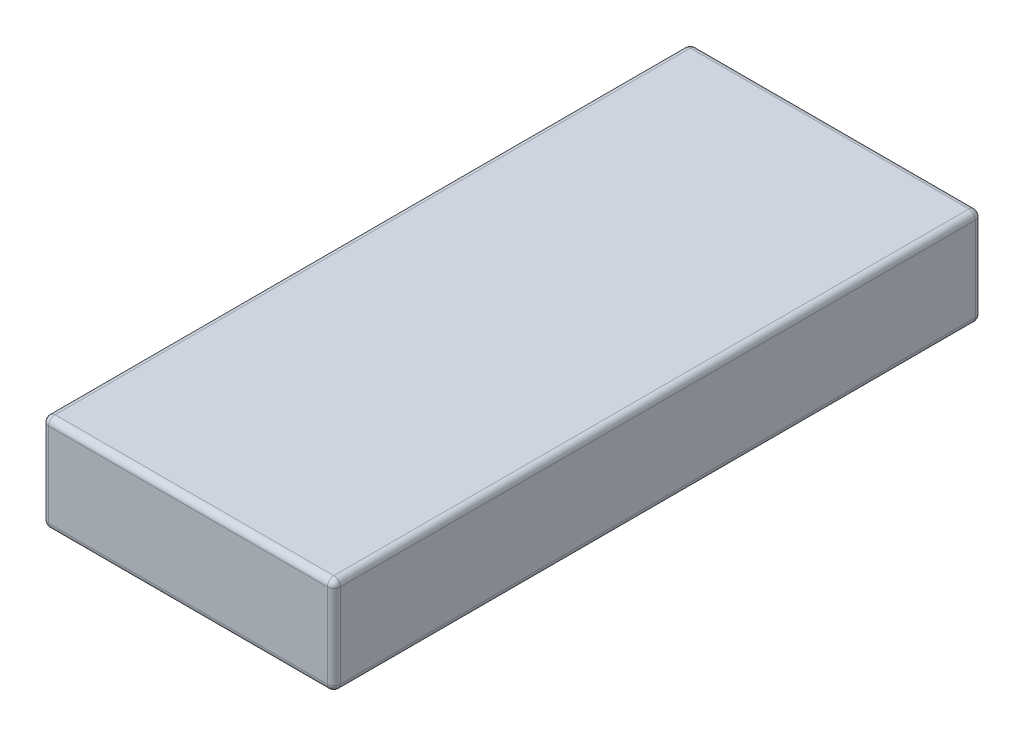
ISO-10303-21;
HEADER;
FILE_DESCRIPTION(('STEP AP214'),'2;1');
FILE_NAME('part.step','',(''),(''),'','','');
FILE_SCHEMA(('AUTOMOTIVE_DESIGN { 1 0 10303 214 1 1 1 1 }'));
ENDSEC;
DATA;
#1=APPLICATION_CONTEXT('core data for automotive mechanical design processes');
#2=APPLICATION_PROTOCOL_DEFINITION('international standard','automotive_design',2000,#1);
#3=PRODUCT_CONTEXT('',#1,'mechanical');
#4=PRODUCT('Part','Part','',(#3));
#5=PRODUCT_RELATED_PRODUCT_CATEGORY('part','',(#4));
#6=PRODUCT_DEFINITION_FORMATION('','',#4);
#7=PRODUCT_DEFINITION_CONTEXT('part definition',#1,'design');
#8=PRODUCT_DEFINITION('design','',#6,#7);
#9=PRODUCT_DEFINITION_SHAPE('','',#8);
#10=(LENGTH_UNIT() NAMED_UNIT(*) SI_UNIT(.MILLI.,.METRE.));
#11=(NAMED_UNIT(*) PLANE_ANGLE_UNIT() SI_UNIT($,.RADIAN.));
#12=(NAMED_UNIT(*) SI_UNIT($,.STERADIAN.) SOLID_ANGLE_UNIT());
#13=UNCERTAINTY_MEASURE_WITH_UNIT(LENGTH_MEASURE(1.E-05),#10,'distance_accuracy_value','');
#14=(GEOMETRIC_REPRESENTATION_CONTEXT(3) GLOBAL_UNCERTAINTY_ASSIGNED_CONTEXT((#13)) GLOBAL_UNIT_ASSIGNED_CONTEXT((#10,
#11,#12)) REPRESENTATION_CONTEXT('',''));
#15=CARTESIAN_POINT('',(0.,0.,0.));
#16=DIRECTION('',(0.,0.,1.));
#17=DIRECTION('',(1.,0.,0.));
#18=AXIS2_PLACEMENT_3D('',#15,#16,#17);
#19=CARTESIAN_POINT('',(450.,300.,-1000.));
#20=DIRECTION('',(-1.,0.,0.));
#21=DIRECTION('',(0.,0.,1.));
#22=AXIS2_PLACEMENT_3D('',#19,#20,#21);
#23=PLANE('',#22);
#24=DIRECTION('',(0.,-1.,0.));
#25=VECTOR('',#24,1.);
#26=CARTESIAN_POINT('',(450.,300.,980.));
#27=LINE('',#26,#25);
#28=CARTESIAN_POINT('',(450.,280.,980.));
#29=VERTEX_POINT('',#28);
#30=CARTESIAN_POINT('',(450.,20.,980.));
#31=VERTEX_POINT('',#30);
#32=EDGE_CURVE('E153',#29,#31,#27,.T.);
#33=ORIENTED_EDGE('',*,*,#32,.T.);
#34=DIRECTION('',(0.,0.,-1.));
#35=VECTOR('',#34,1.);
#36=CARTESIAN_POINT('',(450.,20.,-1000.));
#37=LINE('',#36,#35);
#38=CARTESIAN_POINT('',(450.,20.,-980.));
#39=VERTEX_POINT('',#38);
#40=EDGE_CURVE('E237',#31,#39,#37,.T.);
#41=ORIENTED_EDGE('',*,*,#40,.T.);
#42=DIRECTION('',(0.,-1.,0.));
#43=VECTOR('',#42,1.);
#44=CARTESIAN_POINT('',(450.,300.,-980.));
#45=LINE('',#44,#43);
#46=CARTESIAN_POINT('',(450.,280.,-980.));
#47=VERTEX_POINT('',#46);
#48=EDGE_CURVE('E235',#39,#47,#45,.F.);
#49=ORIENTED_EDGE('',*,*,#48,.T.);
#50=DIRECTION('',(0.,0.,-1.));
#51=VECTOR('',#50,1.);
#52=CARTESIAN_POINT('',(450.,280.,1000.));
#53=LINE('',#52,#51);
#54=EDGE_CURVE('E232',#47,#29,#53,.F.);
#55=ORIENTED_EDGE('',*,*,#54,.T.);
#56=EDGE_LOOP('',(#33,#41,#49,#55));
#57=FACE_BOUND('',#56,.T.);
#58=ADVANCED_FACE('F33',(#57),#23,.F.);
#59=CARTESIAN_POINT('',(-450.,300.,-1000.));
#60=DIRECTION('',(0.,0.,1.));
#61=DIRECTION('',(1.,0.,0.));
#62=AXIS2_PLACEMENT_3D('',#59,#60,#61);
#63=PLANE('',#62);
#64=DIRECTION('',(0.,-1.,0.));
#65=VECTOR('',#64,1.);
#66=CARTESIAN_POINT('',(430.,300.,-1000.));
#67=LINE('',#66,#65);
#68=CARTESIAN_POINT('',(430.,280.,-1000.));
#69=VERTEX_POINT('',#68);
#70=CARTESIAN_POINT('',(430.,20.,-1000.));
#71=VERTEX_POINT('',#70);
#72=EDGE_CURVE('E228',#69,#71,#67,.T.);
#73=ORIENTED_EDGE('',*,*,#72,.T.);
#74=DIRECTION('',(-1.,0.,0.));
#75=VECTOR('',#74,1.);
#76=CARTESIAN_POINT('',(-450.,20.,-1000.));
#77=LINE('',#76,#75);
#78=CARTESIAN_POINT('',(-430.,20.,-1000.));
#79=VERTEX_POINT('',#78);
#80=EDGE_CURVE('E230',#71,#79,#77,.T.);
#81=ORIENTED_EDGE('',*,*,#80,.T.);
#82=DIRECTION('',(0.,-1.,0.));
#83=VECTOR('',#82,1.);
#84=CARTESIAN_POINT('',(-430.,300.,-1000.));
#85=LINE('',#84,#83);
#86=CARTESIAN_POINT('',(-430.,280.,-1000.));
#87=VERTEX_POINT('',#86);
#88=EDGE_CURVE('E211',#79,#87,#85,.F.);
#89=ORIENTED_EDGE('',*,*,#88,.T.);
#90=DIRECTION('',(-1.,0.,0.));
#91=VECTOR('',#90,1.);
#92=CARTESIAN_POINT('',(450.,280.,-1000.));
#93=LINE('',#92,#91);
#94=EDGE_CURVE('E220',#87,#69,#93,.F.);
#95=ORIENTED_EDGE('',*,*,#94,.T.);
#96=EDGE_LOOP('',(#73,#81,#89,#95));
#97=FACE_BOUND('',#96,.T.);
#98=ADVANCED_FACE('F292',(#97),#63,.F.);
#99=CARTESIAN_POINT('',(-450.,300.,-1000.));
#100=DIRECTION('',(1.,0.,0.));
#101=DIRECTION('',(0.,0.,-1.));
#102=AXIS2_PLACEMENT_3D('',#99,#100,#101);
#103=PLANE('',#102);
#104=DIRECTION('',(0.,-1.,0.));
#105=VECTOR('',#104,1.);
#106=CARTESIAN_POINT('',(-450.,300.,-980.));
#107=LINE('',#106,#105);
#108=CARTESIAN_POINT('',(-450.,280.,-980.));
#109=VERTEX_POINT('',#108);
#110=CARTESIAN_POINT('',(-450.,20.,-980.));
#111=VERTEX_POINT('',#110);
#112=EDGE_CURVE('E213',#109,#111,#107,.T.);
#113=ORIENTED_EDGE('',*,*,#112,.T.);
#114=DIRECTION('',(0.,0.,1.));
#115=VECTOR('',#114,1.);
#116=CARTESIAN_POINT('',(-450.,20.,-1000.));
#117=LINE('',#116,#115);
#118=CARTESIAN_POINT('',(-450.,20.,980.));
#119=VERTEX_POINT('',#118);
#120=EDGE_CURVE('E217',#111,#119,#117,.T.);
#121=ORIENTED_EDGE('',*,*,#120,.T.);
#122=DIRECTION('',(0.,-1.,0.));
#123=VECTOR('',#122,1.);
#124=CARTESIAN_POINT('',(-450.,300.,980.));
#125=LINE('',#124,#123);
#126=CARTESIAN_POINT('',(-450.,280.,980.));
#127=VERTEX_POINT('',#126);
#128=EDGE_CURVE('E222',#119,#127,#125,.F.);
#129=ORIENTED_EDGE('',*,*,#128,.T.);
#130=DIRECTION('',(0.,0.,1.));
#131=VECTOR('',#130,1.);
#132=CARTESIAN_POINT('',(-450.,280.,-1000.));
#133=LINE('',#132,#131);
#134=EDGE_CURVE('E218',#127,#109,#133,.F.);
#135=ORIENTED_EDGE('',*,*,#134,.T.);
#136=EDGE_LOOP('',(#113,#121,#129,#135));
#137=FACE_BOUND('',#136,.T.);
#138=ADVANCED_FACE('F290',(#137),#103,.F.);
#139=CARTESIAN_POINT('',(-450.,300.,1000.));
#140=DIRECTION('',(0.,0.,-1.));
#141=DIRECTION('',(-1.,0.,0.));
#142=AXIS2_PLACEMENT_3D('',#139,#140,#141);
#143=PLANE('',#142);
#144=DIRECTION('',(0.,-1.,0.));
#145=VECTOR('',#144,1.);
#146=CARTESIAN_POINT('',(-430.,300.,1000.));
#147=LINE('',#146,#145);
#148=CARTESIAN_POINT('',(-430.,280.,1000.));
#149=VERTEX_POINT('',#148);
#150=CARTESIAN_POINT('',(-430.,20.,1000.));
#151=VERTEX_POINT('',#150);
#152=EDGE_CURVE('E132',#149,#151,#147,.T.);
#153=ORIENTED_EDGE('',*,*,#152,.T.);
#154=DIRECTION('',(1.,0.,0.));
#155=VECTOR('',#154,1.);
#156=CARTESIAN_POINT('',(-450.,20.,1000.));
#157=LINE('',#156,#155);
#158=CARTESIAN_POINT('',(430.,20.,1000.));
#159=VERTEX_POINT('',#158);
#160=EDGE_CURVE('E128',#151,#159,#157,.T.);
#161=ORIENTED_EDGE('',*,*,#160,.T.);
#162=DIRECTION('',(0.,-1.,0.));
#163=VECTOR('',#162,1.);
#164=CARTESIAN_POINT('',(430.,300.,1000.));
#165=LINE('',#164,#163);
#166=CARTESIAN_POINT('',(430.,280.,1000.));
#167=VERTEX_POINT('',#166);
#168=EDGE_CURVE('E122',#159,#167,#165,.F.);
#169=ORIENTED_EDGE('',*,*,#168,.T.);
#170=DIRECTION('',(1.,0.,0.));
#171=VECTOR('',#170,1.);
#172=CARTESIAN_POINT('',(-450.,280.,1000.));
#173=LINE('',#172,#171);
#174=EDGE_CURVE('E125',#167,#149,#173,.F.);
#175=ORIENTED_EDGE('',*,*,#174,.T.);
#176=EDGE_LOOP('',(#153,#161,#169,#175));
#177=FACE_BOUND('',#176,.T.);
#178=ADVANCED_FACE('F124',(#177),#143,.F.);
#179=CARTESIAN_POINT('',(0.,300.,0.));
#180=DIRECTION('',(0.,1.,0.));
#181=DIRECTION('',(0.,0.,1.));
#182=AXIS2_PLACEMENT_3D('',#179,#180,#181);
#183=PLANE('',#182);
#184=DIRECTION('',(0.,0.,-1.));
#185=VECTOR('',#184,1.);
#186=CARTESIAN_POINT('',(430.,300.,-1000.));
#187=LINE('',#186,#185);
#188=CARTESIAN_POINT('',(430.,300.,980.));
#189=VERTEX_POINT('',#188);
#190=CARTESIAN_POINT('',(430.,300.,-980.));
#191=VERTEX_POINT('',#190);
#192=EDGE_CURVE('E240',#189,#191,#187,.T.);
#193=ORIENTED_EDGE('',*,*,#192,.T.);
#194=DIRECTION('',(-1.,0.,0.));
#195=VECTOR('',#194,1.);
#196=CARTESIAN_POINT('',(-450.,300.,-980.));
#197=LINE('',#196,#195);
#198=CARTESIAN_POINT('',(-430.,300.,-980.));
#199=VERTEX_POINT('',#198);
#200=EDGE_CURVE('E11',#191,#199,#197,.T.);
#201=ORIENTED_EDGE('',*,*,#200,.T.);
#202=DIRECTION('',(0.,0.,1.));
#203=VECTOR('',#202,1.);
#204=CARTESIAN_POINT('',(-430.,300.,1000.));
#205=LINE('',#204,#203);
#206=CARTESIAN_POINT('',(-430.,300.,980.));
#207=VERTEX_POINT('',#206);
#208=EDGE_CURVE('E42',#199,#207,#205,.T.);
#209=ORIENTED_EDGE('',*,*,#208,.T.);
#210=DIRECTION('',(1.,0.,0.));
#211=VECTOR('',#210,1.);
#212=CARTESIAN_POINT('',(450.,300.,980.));
#213=LINE('',#212,#211);
#214=EDGE_CURVE('E242',#207,#189,#213,.T.);
#215=ORIENTED_EDGE('',*,*,#214,.T.);
#216=EDGE_LOOP('',(#193,#201,#209,#215));
#217=FACE_BOUND('',#216,.T.);
#218=ADVANCED_FACE('F298',(#217),#183,.T.);
#219=CARTESIAN_POINT('',(0.,0.,0.));
#220=DIRECTION('',(0.,1.,0.));
#221=DIRECTION('',(0.,0.,1.));
#222=AXIS2_PLACEMENT_3D('',#219,#220,#221);
#223=PLANE('',#222);
#224=DIRECTION('',(0.,0.,-1.));
#225=VECTOR('',#224,1.);
#226=CARTESIAN_POINT('',(430.,0.,0.));
#227=LINE('',#226,#225);
#228=CARTESIAN_POINT('',(430.,0.,-980.));
#229=VERTEX_POINT('',#228);
#230=CARTESIAN_POINT('',(430.,0.,980.));
#231=VERTEX_POINT('',#230);
#232=EDGE_CURVE('E277',#229,#231,#227,.F.);
#233=ORIENTED_EDGE('',*,*,#232,.T.);
#234=DIRECTION('',(1.,0.,0.));
#235=VECTOR('',#234,1.);
#236=CARTESIAN_POINT('',(0.,0.,980.));
#237=LINE('',#236,#235);
#238=CARTESIAN_POINT('',(-430.,0.,980.));
#239=VERTEX_POINT('',#238);
#240=EDGE_CURVE('E271',#231,#239,#237,.F.);
#241=ORIENTED_EDGE('',*,*,#240,.T.);
#242=DIRECTION('',(0.,0.,1.));
#243=VECTOR('',#242,1.);
#244=CARTESIAN_POINT('',(-430.,0.,0.));
#245=LINE('',#244,#243);
#246=CARTESIAN_POINT('',(-430.,0.,-980.));
#247=VERTEX_POINT('',#246);
#248=EDGE_CURVE('E266',#239,#247,#245,.F.);
#249=ORIENTED_EDGE('',*,*,#248,.T.);
#250=DIRECTION('',(-1.,0.,0.));
#251=VECTOR('',#250,1.);
#252=CARTESIAN_POINT('',(0.,0.,-980.));
#253=LINE('',#252,#251);
#254=EDGE_CURVE('E272',#247,#229,#253,.F.);
#255=ORIENTED_EDGE('',*,*,#254,.T.);
#256=EDGE_LOOP('',(#233,#241,#249,#255));
#257=FACE_BOUND('',#256,.T.);
#258=ADVANCED_FACE('F275',(#257),#223,.F.);
#259=CARTESIAN_POINT('',(0.,280.,-980.));
#260=DIRECTION('',(1.,0.,0.));
#261=DIRECTION('',(0.,0.,-1.));
#262=AXIS2_PLACEMENT_3D('',#259,#260,#261);
#263=CYLINDRICAL_SURFACE('',#262,20.);
#264=CARTESIAN_POINT('',(-430.,280.,-980.));
#265=DIRECTION('',(-1.,0.,0.));
#266=DIRECTION('',(0.,0.,1.));
#267=AXIS2_PLACEMENT_3D('',#264,#265,#266);
#268=CIRCLE('',#267,20.);
#269=EDGE_CURVE('E37',#199,#87,#268,.T.);
#270=ORIENTED_EDGE('',*,*,#269,.F.);
#271=ORIENTED_EDGE('',*,*,#200,.F.);
#272=CARTESIAN_POINT('',(430.,280.,-980.));
#273=DIRECTION('',(1.,0.,0.));
#274=DIRECTION('',(0.,1.,0.));
#275=AXIS2_PLACEMENT_3D('',#272,#273,#274);
#276=CIRCLE('',#275,20.);
#277=EDGE_CURVE('E192',#69,#191,#276,.T.);
#278=ORIENTED_EDGE('',*,*,#277,.F.);
#279=ORIENTED_EDGE('',*,*,#94,.F.);
#280=EDGE_LOOP('',(#270,#271,#278,#279));
#281=FACE_BOUND('',#280,.T.);
#282=ADVANCED_FACE('F35',(#281),#263,.T.);
#283=CARTESIAN_POINT('',(-430.,280.,-980.));
#284=DIRECTION('',(0.,0.,1.));
#285=DIRECTION('',(1.,0.,0.));
#286=AXIS2_PLACEMENT_3D('',#283,#284,#285);
#287=SPHERICAL_SURFACE('',#286,20.);
#288=CARTESIAN_POINT('',(-430.,280.,-980.));
#289=DIRECTION('',(0.,0.,-1.));
#290=DIRECTION('',(-1.,0.,0.));
#291=AXIS2_PLACEMENT_3D('',#288,#289,#290);
#292=CIRCLE('',#291,20.);
#293=EDGE_CURVE('E188',#199,#109,#292,.F.);
#294=ORIENTED_EDGE('',*,*,#293,.F.);
#295=ORIENTED_EDGE('',*,*,#269,.T.);
#296=CARTESIAN_POINT('',(-430.,280.,-980.));
#297=DIRECTION('',(0.,1.,0.));
#298=DIRECTION('',(0.,0.,1.));
#299=AXIS2_PLACEMENT_3D('',#296,#297,#298);
#300=CIRCLE('',#299,20.);
#301=EDGE_CURVE('E190',#109,#87,#300,.F.);
#302=ORIENTED_EDGE('',*,*,#301,.F.);
#303=EDGE_LOOP('',(#294,#295,#302));
#304=FACE_BOUND('',#303,.T.);
#305=ADVANCED_FACE('F202',(#304),#287,.T.);
#306=CARTESIAN_POINT('',(430.,280.,-980.));
#307=DIRECTION('',(0.,0.,1.));
#308=DIRECTION('',(1.,0.,0.));
#309=AXIS2_PLACEMENT_3D('',#306,#307,#308);
#310=SPHERICAL_SURFACE('',#309,20.);
#311=CARTESIAN_POINT('',(430.,280.,-980.));
#312=DIRECTION('',(0.,1.,0.));
#313=DIRECTION('',(0.,0.,1.));
#314=AXIS2_PLACEMENT_3D('',#311,#312,#313);
#315=CIRCLE('',#314,20.);
#316=EDGE_CURVE('E182',#69,#47,#315,.F.);
#317=ORIENTED_EDGE('',*,*,#316,.F.);
#318=ORIENTED_EDGE('',*,*,#277,.T.);
#319=CARTESIAN_POINT('',(430.,280.,-980.));
#320=DIRECTION('',(0.,0.,-1.));
#321=DIRECTION('',(-1.,0.,0.));
#322=AXIS2_PLACEMENT_3D('',#319,#320,#321);
#323=CIRCLE('',#322,20.);
#324=EDGE_CURVE('E185',#47,#191,#323,.F.);
#325=ORIENTED_EDGE('',*,*,#324,.F.);
#326=EDGE_LOOP('',(#317,#318,#325));
#327=FACE_BOUND('',#326,.T.);
#328=ADVANCED_FACE('F360',(#327),#310,.T.);
#329=CARTESIAN_POINT('',(-430.,300.,-980.));
#330=DIRECTION('',(0.,-1.,0.));
#331=DIRECTION('',(0.,0.,-1.));
#332=AXIS2_PLACEMENT_3D('',#329,#330,#331);
#333=CYLINDRICAL_SURFACE('',#332,20.);
#334=ORIENTED_EDGE('',*,*,#301,.T.);
#335=ORIENTED_EDGE('',*,*,#88,.F.);
#336=CARTESIAN_POINT('',(-430.,20.,-980.));
#337=DIRECTION('',(0.,-1.,0.));
#338=DIRECTION('',(0.,0.,-1.));
#339=AXIS2_PLACEMENT_3D('',#336,#337,#338);
#340=CIRCLE('',#339,20.);
#341=EDGE_CURVE('E177',#111,#79,#340,.T.);
#342=ORIENTED_EDGE('',*,*,#341,.F.);
#343=ORIENTED_EDGE('',*,*,#112,.F.);
#344=EDGE_LOOP('',(#334,#335,#342,#343));
#345=FACE_BOUND('',#344,.T.);
#346=ADVANCED_FACE('F209',(#345),#333,.T.);
#347=CARTESIAN_POINT('',(-430.,280.,0.));
#348=DIRECTION('',(0.,0.,-1.));
#349=DIRECTION('',(-1.,0.,0.));
#350=AXIS2_PLACEMENT_3D('',#347,#348,#349);
#351=CYLINDRICAL_SURFACE('',#350,20.);
#352=ORIENTED_EDGE('',*,*,#293,.T.);
#353=ORIENTED_EDGE('',*,*,#134,.F.);
#354=CARTESIAN_POINT('',(-430.,280.,980.));
#355=DIRECTION('',(0.,0.,1.));
#356=DIRECTION('',(1.,0.,0.));
#357=AXIS2_PLACEMENT_3D('',#354,#355,#356);
#358=CIRCLE('',#357,20.);
#359=EDGE_CURVE('E174',#207,#127,#358,.T.);
#360=ORIENTED_EDGE('',*,*,#359,.F.);
#361=ORIENTED_EDGE('',*,*,#208,.F.);
#362=EDGE_LOOP('',(#352,#353,#360,#361));
#363=FACE_BOUND('',#362,.T.);
#364=ADVANCED_FACE('F355',(#363),#351,.T.);
#365=CARTESIAN_POINT('',(0.,280.,980.));
#366=DIRECTION('',(-1.,0.,0.));
#367=DIRECTION('',(0.,0.,1.));
#368=AXIS2_PLACEMENT_3D('',#365,#366,#367);
#369=CYLINDRICAL_SURFACE('',#368,20.);
#370=CARTESIAN_POINT('',(430.,280.,980.));
#371=DIRECTION('',(1.,0.,0.));
#372=DIRECTION('',(0.,0.,-1.));
#373=AXIS2_PLACEMENT_3D('',#370,#371,#372);
#374=CIRCLE('',#373,20.);
#375=EDGE_CURVE('E138',#189,#167,#374,.T.);
#376=ORIENTED_EDGE('',*,*,#375,.F.);
#377=ORIENTED_EDGE('',*,*,#214,.F.);
#378=CARTESIAN_POINT('',(-430.,280.,980.));
#379=DIRECTION('',(-1.,0.,0.));
#380=DIRECTION('',(0.,0.,1.));
#381=AXIS2_PLACEMENT_3D('',#378,#379,#380);
#382=CIRCLE('',#381,20.);
#383=EDGE_CURVE('E141',#149,#207,#382,.T.);
#384=ORIENTED_EDGE('',*,*,#383,.F.);
#385=ORIENTED_EDGE('',*,*,#174,.F.);
#386=EDGE_LOOP('',(#376,#377,#384,#385));
#387=FACE_BOUND('',#386,.T.);
#388=ADVANCED_FACE('F137',(#387),#369,.T.);
#389=CARTESIAN_POINT('',(430.,280.,0.));
#390=DIRECTION('',(0.,0.,1.));
#391=DIRECTION('',(1.,0.,0.));
#392=AXIS2_PLACEMENT_3D('',#389,#390,#391);
#393=CYLINDRICAL_SURFACE('',#392,20.);
#394=ORIENTED_EDGE('',*,*,#324,.T.);
#395=ORIENTED_EDGE('',*,*,#192,.F.);
#396=CARTESIAN_POINT('',(430.,280.,980.));
#397=DIRECTION('',(0.,0.,1.));
#398=DIRECTION('',(0.,-1.,0.));
#399=AXIS2_PLACEMENT_3D('',#396,#397,#398);
#400=CIRCLE('',#399,20.);
#401=EDGE_CURVE('E150',#29,#189,#400,.T.);
#402=ORIENTED_EDGE('',*,*,#401,.F.);
#403=ORIENTED_EDGE('',*,*,#54,.F.);
#404=EDGE_LOOP('',(#394,#395,#402,#403));
#405=FACE_BOUND('',#404,.T.);
#406=ADVANCED_FACE('F348',(#405),#393,.T.);
#407=CARTESIAN_POINT('',(430.,300.,-980.));
#408=DIRECTION('',(0.,-1.,0.));
#409=DIRECTION('',(0.,0.,-1.));
#410=AXIS2_PLACEMENT_3D('',#407,#408,#409);
#411=CYLINDRICAL_SURFACE('',#410,20.);
#412=ORIENTED_EDGE('',*,*,#316,.T.);
#413=ORIENTED_EDGE('',*,*,#48,.F.);
#414=CARTESIAN_POINT('',(430.,20.,-980.));
#415=DIRECTION('',(0.,-1.,0.));
#416=DIRECTION('',(0.,0.,-1.));
#417=AXIS2_PLACEMENT_3D('',#414,#415,#416);
#418=CIRCLE('',#417,20.);
#419=EDGE_CURVE('E169',#71,#39,#418,.T.);
#420=ORIENTED_EDGE('',*,*,#419,.F.);
#421=ORIENTED_EDGE('',*,*,#72,.F.);
#422=EDGE_LOOP('',(#412,#413,#420,#421));
#423=FACE_BOUND('',#422,.T.);
#424=ADVANCED_FACE('F344',(#423),#411,.T.);
#425=CARTESIAN_POINT('',(-450.,20.,-980.));
#426=DIRECTION('',(-1.,0.,0.));
#427=DIRECTION('',(0.,0.,1.));
#428=AXIS2_PLACEMENT_3D('',#425,#426,#427);
#429=CYLINDRICAL_SURFACE('',#428,20.);
#430=CARTESIAN_POINT('',(-430.,20.,-980.));
#431=DIRECTION('',(-1.,0.,0.));
#432=DIRECTION('',(0.,0.,1.));
#433=AXIS2_PLACEMENT_3D('',#430,#431,#432);
#434=CIRCLE('',#433,20.);
#435=EDGE_CURVE('E179',#79,#247,#434,.T.);
#436=ORIENTED_EDGE('',*,*,#435,.F.);
#437=ORIENTED_EDGE('',*,*,#80,.F.);
#438=CARTESIAN_POINT('',(430.,20.,-980.));
#439=DIRECTION('',(1.,0.,0.));
#440=DIRECTION('',(0.,0.,-1.));
#441=AXIS2_PLACEMENT_3D('',#438,#439,#440);
#442=CIRCLE('',#441,20.);
#443=EDGE_CURVE('E166',#229,#71,#442,.T.);
#444=ORIENTED_EDGE('',*,*,#443,.F.);
#445=ORIENTED_EDGE('',*,*,#254,.F.);
#446=EDGE_LOOP('',(#436,#437,#444,#445));
#447=FACE_BOUND('',#446,.T.);
#448=ADVANCED_FACE('F340',(#447),#429,.T.);
#449=CARTESIAN_POINT('',(-430.,20.,-980.));
#450=DIRECTION('',(0.,0.,1.));
#451=DIRECTION('',(1.,0.,0.));
#452=AXIS2_PLACEMENT_3D('',#449,#450,#451);
#453=SPHERICAL_SURFACE('',#452,20.);
#454=ORIENTED_EDGE('',*,*,#341,.T.);
#455=ORIENTED_EDGE('',*,*,#435,.T.);
#456=CARTESIAN_POINT('',(-430.,20.,-980.));
#457=DIRECTION('',(0.,0.,-1.));
#458=DIRECTION('',(-1.,0.,0.));
#459=AXIS2_PLACEMENT_3D('',#456,#457,#458);
#460=CIRCLE('',#459,20.);
#461=EDGE_CURVE('E158',#111,#247,#460,.F.);
#462=ORIENTED_EDGE('',*,*,#461,.F.);
#463=EDGE_LOOP('',(#454,#455,#462));
#464=FACE_BOUND('',#463,.T.);
#465=ADVANCED_FACE('F336',(#464),#453,.T.);
#466=CARTESIAN_POINT('',(-430.,280.,980.));
#467=DIRECTION('',(0.,0.,1.));
#468=DIRECTION('',(1.,0.,0.));
#469=AXIS2_PLACEMENT_3D('',#466,#467,#468);
#470=SPHERICAL_SURFACE('',#469,20.);
#471=ORIENTED_EDGE('',*,*,#383,.T.);
#472=ORIENTED_EDGE('',*,*,#359,.T.);
#473=CARTESIAN_POINT('',(-430.,280.,980.));
#474=DIRECTION('',(0.,1.,0.));
#475=DIRECTION('',(0.,0.,1.));
#476=AXIS2_PLACEMENT_3D('',#473,#474,#475);
#477=CIRCLE('',#476,20.);
#478=EDGE_CURVE('E154',#149,#127,#477,.F.);
#479=ORIENTED_EDGE('',*,*,#478,.F.);
#480=EDGE_LOOP('',(#471,#472,#479));
#481=FACE_BOUND('',#480,.T.);
#482=ADVANCED_FACE('F333',(#481),#470,.T.);
#483=CARTESIAN_POINT('',(430.,280.,980.));
#484=DIRECTION('',(0.,0.,1.));
#485=DIRECTION('',(1.,0.,0.));
#486=AXIS2_PLACEMENT_3D('',#483,#484,#485);
#487=SPHERICAL_SURFACE('',#486,20.);
#488=ORIENTED_EDGE('',*,*,#401,.T.);
#489=ORIENTED_EDGE('',*,*,#375,.T.);
#490=CARTESIAN_POINT('',(430.,280.,980.));
#491=DIRECTION('',(0.,1.,0.));
#492=DIRECTION('',(0.,0.,1.));
#493=AXIS2_PLACEMENT_3D('',#490,#491,#492);
#494=CIRCLE('',#493,20.);
#495=EDGE_CURVE('E147',#29,#167,#494,.F.);
#496=ORIENTED_EDGE('',*,*,#495,.F.);
#497=EDGE_LOOP('',(#488,#489,#496));
#498=FACE_BOUND('',#497,.T.);
#499=ADVANCED_FACE('F146',(#498),#487,.T.);
#500=CARTESIAN_POINT('',(430.,20.,-980.));
#501=DIRECTION('',(0.,0.,1.));
#502=DIRECTION('',(1.,0.,0.));
#503=AXIS2_PLACEMENT_3D('',#500,#501,#502);
#504=SPHERICAL_SURFACE('',#503,20.);
#505=ORIENTED_EDGE('',*,*,#443,.T.);
#506=ORIENTED_EDGE('',*,*,#419,.T.);
#507=CARTESIAN_POINT('',(430.,20.,-980.));
#508=DIRECTION('',(0.,0.,-1.));
#509=DIRECTION('',(-1.,0.,0.));
#510=AXIS2_PLACEMENT_3D('',#507,#508,#509);
#511=CIRCLE('',#510,20.);
#512=EDGE_CURVE('E155',#229,#39,#511,.F.);
#513=ORIENTED_EDGE('',*,*,#512,.F.);
#514=EDGE_LOOP('',(#505,#506,#513));
#515=FACE_BOUND('',#514,.T.);
#516=ADVANCED_FACE('F327',(#515),#504,.T.);
#517=CARTESIAN_POINT('',(-430.,20.,-1000.));
#518=DIRECTION('',(0.,0.,1.));
#519=DIRECTION('',(1.,0.,0.));
#520=AXIS2_PLACEMENT_3D('',#517,#518,#519);
#521=CYLINDRICAL_SURFACE('',#520,20.);
#522=ORIENTED_EDGE('',*,*,#461,.T.);
#523=ORIENTED_EDGE('',*,*,#248,.F.);
#524=CARTESIAN_POINT('',(-430.,20.,980.));
#525=DIRECTION('',(0.,0.,1.));
#526=DIRECTION('',(1.,0.,0.));
#527=AXIS2_PLACEMENT_3D('',#524,#525,#526);
#528=CIRCLE('',#527,20.);
#529=EDGE_CURVE('E160',#119,#239,#528,.T.);
#530=ORIENTED_EDGE('',*,*,#529,.F.);
#531=ORIENTED_EDGE('',*,*,#120,.F.);
#532=EDGE_LOOP('',(#522,#523,#530,#531));
#533=FACE_BOUND('',#532,.T.);
#534=ADVANCED_FACE('F268',(#533),#521,.T.);
#535=CARTESIAN_POINT('',(-430.,300.,980.));
#536=DIRECTION('',(0.,-1.,0.));
#537=DIRECTION('',(0.,0.,-1.));
#538=AXIS2_PLACEMENT_3D('',#535,#536,#537);
#539=CYLINDRICAL_SURFACE('',#538,20.);
#540=ORIENTED_EDGE('',*,*,#478,.T.);
#541=ORIENTED_EDGE('',*,*,#128,.F.);
#542=CARTESIAN_POINT('',(-430.,20.,980.));
#543=DIRECTION('',(0.,-1.,0.));
#544=DIRECTION('',(0.,0.,-1.));
#545=AXIS2_PLACEMENT_3D('',#542,#543,#544);
#546=CIRCLE('',#545,20.);
#547=EDGE_CURVE('E255',#151,#119,#546,.T.);
#548=ORIENTED_EDGE('',*,*,#547,.F.);
#549=ORIENTED_EDGE('',*,*,#152,.F.);
#550=EDGE_LOOP('',(#540,#541,#548,#549));
#551=FACE_BOUND('',#550,.T.);
#552=ADVANCED_FACE('F288',(#551),#539,.T.);
#553=CARTESIAN_POINT('',(430.,300.,980.));
#554=DIRECTION('',(0.,-1.,0.));
#555=DIRECTION('',(0.,0.,-1.));
#556=AXIS2_PLACEMENT_3D('',#553,#554,#555);
#557=CYLINDRICAL_SURFACE('',#556,20.);
#558=ORIENTED_EDGE('',*,*,#495,.T.);
#559=ORIENTED_EDGE('',*,*,#168,.F.);
#560=CARTESIAN_POINT('',(430.,20.,980.));
#561=DIRECTION('',(0.,-1.,0.));
#562=DIRECTION('',(0.,0.,-1.));
#563=AXIS2_PLACEMENT_3D('',#560,#561,#562);
#564=CIRCLE('',#563,20.);
#565=EDGE_CURVE('E252',#31,#159,#564,.T.);
#566=ORIENTED_EDGE('',*,*,#565,.F.);
#567=ORIENTED_EDGE('',*,*,#32,.F.);
#568=EDGE_LOOP('',(#558,#559,#566,#567));
#569=FACE_BOUND('',#568,.T.);
#570=ADVANCED_FACE('F152',(#569),#557,.T.);
#571=CARTESIAN_POINT('',(430.,20.,-1000.));
#572=DIRECTION('',(0.,0.,-1.));
#573=DIRECTION('',(-1.,0.,0.));
#574=AXIS2_PLACEMENT_3D('',#571,#572,#573);
#575=CYLINDRICAL_SURFACE('',#574,20.);
#576=ORIENTED_EDGE('',*,*,#512,.T.);
#577=ORIENTED_EDGE('',*,*,#40,.F.);
#578=CARTESIAN_POINT('',(430.,20.,980.));
#579=DIRECTION('',(0.,0.,1.));
#580=DIRECTION('',(1.,0.,0.));
#581=AXIS2_PLACEMENT_3D('',#578,#579,#580);
#582=CIRCLE('',#581,20.);
#583=EDGE_CURVE('E249',#231,#31,#582,.T.);
#584=ORIENTED_EDGE('',*,*,#583,.F.);
#585=ORIENTED_EDGE('',*,*,#232,.F.);
#586=EDGE_LOOP('',(#576,#577,#584,#585));
#587=FACE_BOUND('',#586,.T.);
#588=ADVANCED_FACE('F317',(#587),#575,.T.);
#589=CARTESIAN_POINT('',(-430.,20.,980.));
#590=DIRECTION('',(0.,0.,1.));
#591=DIRECTION('',(1.,0.,0.));
#592=AXIS2_PLACEMENT_3D('',#589,#590,#591);
#593=SPHERICAL_SURFACE('',#592,20.);
#594=ORIENTED_EDGE('',*,*,#547,.T.);
#595=ORIENTED_EDGE('',*,*,#529,.T.);
#596=CARTESIAN_POINT('',(-430.,20.,980.));
#597=DIRECTION('',(-1.,0.,0.));
#598=DIRECTION('',(0.,0.,1.));
#599=AXIS2_PLACEMENT_3D('',#596,#597,#598);
#600=CIRCLE('',#599,20.);
#601=EDGE_CURVE('E247',#151,#239,#600,.F.);
#602=ORIENTED_EDGE('',*,*,#601,.F.);
#603=EDGE_LOOP('',(#594,#595,#602));
#604=FACE_BOUND('',#603,.T.);
#605=ADVANCED_FACE('F261',(#604),#593,.T.);
#606=CARTESIAN_POINT('',(430.,20.,980.));
#607=DIRECTION('',(0.,0.,1.));
#608=DIRECTION('',(1.,0.,0.));
#609=AXIS2_PLACEMENT_3D('',#606,#607,#608);
#610=SPHERICAL_SURFACE('',#609,20.);
#611=ORIENTED_EDGE('',*,*,#583,.T.);
#612=ORIENTED_EDGE('',*,*,#565,.T.);
#613=CARTESIAN_POINT('',(430.,20.,980.));
#614=DIRECTION('',(1.,0.,0.));
#615=DIRECTION('',(0.,0.,-1.));
#616=AXIS2_PLACEMENT_3D('',#613,#614,#615);
#617=CIRCLE('',#616,20.);
#618=EDGE_CURVE('E245',#231,#159,#617,.F.);
#619=ORIENTED_EDGE('',*,*,#618,.F.);
#620=EDGE_LOOP('',(#611,#612,#619));
#621=FACE_BOUND('',#620,.T.);
#622=ADVANCED_FACE('F311',(#621),#610,.T.);
#623=CARTESIAN_POINT('',(-450.,20.,980.));
#624=DIRECTION('',(1.,0.,0.));
#625=DIRECTION('',(0.,0.,-1.));
#626=AXIS2_PLACEMENT_3D('',#623,#624,#625);
#627=CYLINDRICAL_SURFACE('',#626,20.);
#628=ORIENTED_EDGE('',*,*,#601,.T.);
#629=ORIENTED_EDGE('',*,*,#240,.F.);
#630=ORIENTED_EDGE('',*,*,#618,.T.);
#631=ORIENTED_EDGE('',*,*,#160,.F.);
#632=EDGE_LOOP('',(#628,#629,#630,#631));
#633=FACE_BOUND('',#632,.T.);
#634=ADVANCED_FACE('F308',(#633),#627,.T.);
#635=CLOSED_SHELL('',(#58,#98,#138,#178,#218,#258,#282,#305,#328,#346,#364,#388,#406,#424,#448,
#465,#482,#499,#516,#534,#552,#570,#588,#605,#622,#634));
#636=MANIFOLD_SOLID_BREP('B2',#635);
#637=ADVANCED_BREP_SHAPE_REPRESENTATION('',(#18,#636),#14);
#638=SHAPE_DEFINITION_REPRESENTATION(#9,#637);
ENDSEC;
END-ISO-10303-21;
